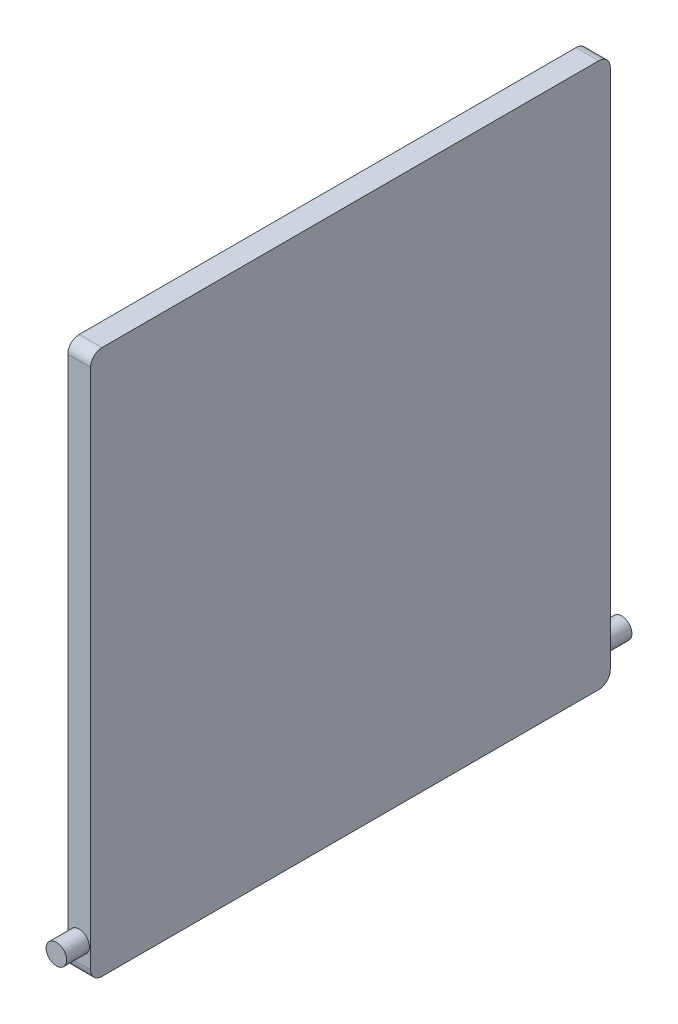
ISO-10303-21;
HEADER;
FILE_DESCRIPTION(('STEP AP214'),'2;1');
FILE_NAME('part.step','',(''),(''),'','','');
FILE_SCHEMA(('AUTOMOTIVE_DESIGN { 1 0 10303 214 1 1 1 1 }'));
ENDSEC;
DATA;
#1=APPLICATION_CONTEXT('core data for automotive mechanical design processes');
#2=APPLICATION_PROTOCOL_DEFINITION('international standard','automotive_design',2000,#1);
#3=PRODUCT_CONTEXT('',#1,'mechanical');
#4=PRODUCT('Part','Part','',(#3));
#5=PRODUCT_RELATED_PRODUCT_CATEGORY('part','',(#4));
#6=PRODUCT_DEFINITION_FORMATION('','',#4);
#7=PRODUCT_DEFINITION_CONTEXT('part definition',#1,'design');
#8=PRODUCT_DEFINITION('design','',#6,#7);
#9=PRODUCT_DEFINITION_SHAPE('','',#8);
#10=(LENGTH_UNIT() NAMED_UNIT(*) SI_UNIT(.MILLI.,.METRE.));
#11=(NAMED_UNIT(*) PLANE_ANGLE_UNIT() SI_UNIT($,.RADIAN.));
#12=(NAMED_UNIT(*) SI_UNIT($,.STERADIAN.) SOLID_ANGLE_UNIT());
#13=UNCERTAINTY_MEASURE_WITH_UNIT(LENGTH_MEASURE(1.E-05),#10,'distance_accuracy_value','');
#14=(GEOMETRIC_REPRESENTATION_CONTEXT(3) GLOBAL_UNCERTAINTY_ASSIGNED_CONTEXT((#13)) GLOBAL_UNIT_ASSIGNED_CONTEXT((#10,
#11,#12)) REPRESENTATION_CONTEXT('',''));
#15=CARTESIAN_POINT('',(0.,0.,0.));
#16=DIRECTION('',(0.,0.,1.));
#17=DIRECTION('',(1.,0.,0.));
#18=AXIS2_PLACEMENT_3D('',#15,#16,#17);
#19=CARTESIAN_POINT('',(-10.,0.,-114.));
#20=DIRECTION('',(0.,0.,-1.));
#21=DIRECTION('',(-1.,0.,0.));
#22=AXIS2_PLACEMENT_3D('',#19,#20,#21);
#23=PLANE('',#22);
#24=DIRECTION('',(0.,1.,0.));
#25=VECTOR('',#24,1.);
#26=CARTESIAN_POINT('',(0.,0.,-114.));
#27=LINE('',#26,#25);
#28=CARTESIAN_POINT('',(0.,5.,-114.));
#29=VERTEX_POINT('',#28);
#30=CARTESIAN_POINT('',(0.,233.91999995,-114.));
#31=VERTEX_POINT('',#30);
#32=EDGE_CURVE('E120',#29,#31,#27,.T.);
#33=ORIENTED_EDGE('',*,*,#32,.F.);
#34=DIRECTION('',(1.,0.,0.));
#35=VECTOR('',#34,1.);
#36=CARTESIAN_POINT('',(-10.,5.,-114.));
#37=LINE('',#36,#35);
#38=CARTESIAN_POINT('',(-10.,5.,-114.));
#39=VERTEX_POINT('',#38);
#40=EDGE_CURVE('E140',#29,#39,#37,.F.);
#41=ORIENTED_EDGE('',*,*,#40,.T.);
#42=DIRECTION('',(0.,1.,0.));
#43=VECTOR('',#42,1.);
#44=CARTESIAN_POINT('',(-10.,0.,-114.));
#45=LINE('',#44,#43);
#46=CARTESIAN_POINT('',(-10.,233.91999995,-114.));
#47=VERTEX_POINT('',#46);
#48=EDGE_CURVE('E167',#39,#47,#45,.T.);
#49=ORIENTED_EDGE('',*,*,#48,.T.);
#50=DIRECTION('',(1.,0.,0.));
#51=VECTOR('',#50,1.);
#52=CARTESIAN_POINT('',(-10.,233.91999995,-114.));
#53=LINE('',#52,#51);
#54=EDGE_CURVE('E137',#47,#31,#53,.T.);
#55=ORIENTED_EDGE('',*,*,#54,.T.);
#56=EDGE_LOOP('',(#33,#41,#49,#55));
#57=FACE_BOUND('',#56,.T.);
#58=CARTESIAN_POINT('',(-5.,13.5,-114.));
#59=DIRECTION('',(0.,0.,-1.));
#60=DIRECTION('',(-1.,0.,0.));
#61=AXIS2_PLACEMENT_3D('',#58,#59,#60);
#62=CIRCLE('',#61,4.5);
#63=CARTESIAN_POINT('',(-9.5,13.5,-114.));
#64=VERTEX_POINT('',#63);
#65=EDGE_CURVE('E171',#64,#64,#62,.T.);
#66=ORIENTED_EDGE('',*,*,#65,.F.);
#67=EDGE_LOOP('',(#66));
#68=FACE_BOUND('',#67,.T.);
#69=ADVANCED_FACE('F34',(#57,#68),#23,.T.);
#70=CARTESIAN_POINT('',(-10.,0.,114.));
#71=DIRECTION('',(0.,0.,1.));
#72=DIRECTION('',(1.,0.,0.));
#73=AXIS2_PLACEMENT_3D('',#70,#71,#72);
#74=PLANE('',#73);
#75=CARTESIAN_POINT('',(-5.,13.5,114.));
#76=DIRECTION('',(0.,0.,1.));
#77=DIRECTION('',(1.,0.,0.));
#78=AXIS2_PLACEMENT_3D('',#75,#76,#77);
#79=CIRCLE('',#78,4.5);
#80=CARTESIAN_POINT('',(-0.499999999999998,13.5,114.));
#81=VERTEX_POINT('',#80);
#82=EDGE_CURVE('E125',#81,#81,#79,.T.);
#83=ORIENTED_EDGE('',*,*,#82,.F.);
#84=EDGE_LOOP('',(#83));
#85=FACE_BOUND('',#84,.T.);
#86=DIRECTION('',(0.,-1.,0.));
#87=VECTOR('',#86,1.);
#88=CARTESIAN_POINT('',(-10.,0.,114.));
#89=LINE('',#88,#87);
#90=CARTESIAN_POINT('',(-10.,233.91999995,114.));
#91=VERTEX_POINT('',#90);
#92=CARTESIAN_POINT('',(-10.,5.,114.));
#93=VERTEX_POINT('',#92);
#94=EDGE_CURVE('E158',#91,#93,#89,.T.);
#95=ORIENTED_EDGE('',*,*,#94,.T.);
#96=DIRECTION('',(1.,0.,0.));
#97=VECTOR('',#96,1.);
#98=CARTESIAN_POINT('',(-10.,5.,114.));
#99=LINE('',#98,#97);
#100=CARTESIAN_POINT('',(0.,5.,114.));
#101=VERTEX_POINT('',#100);
#102=EDGE_CURVE('E150',#93,#101,#99,.T.);
#103=ORIENTED_EDGE('',*,*,#102,.T.);
#104=DIRECTION('',(0.,-1.,0.));
#105=VECTOR('',#104,1.);
#106=CARTESIAN_POINT('',(0.,0.,114.));
#107=LINE('',#106,#105);
#108=CARTESIAN_POINT('',(0.,233.91999995,114.));
#109=VERTEX_POINT('',#108);
#110=EDGE_CURVE('E104',#109,#101,#107,.T.);
#111=ORIENTED_EDGE('',*,*,#110,.F.);
#112=DIRECTION('',(1.,0.,0.));
#113=VECTOR('',#112,1.);
#114=CARTESIAN_POINT('',(-10.,233.91999995,114.));
#115=LINE('',#114,#113);
#116=EDGE_CURVE('E148',#109,#91,#115,.F.);
#117=ORIENTED_EDGE('',*,*,#116,.T.);
#118=EDGE_LOOP('',(#95,#103,#111,#117));
#119=FACE_BOUND('',#118,.T.);
#120=ADVANCED_FACE('F196',(#85,#119),#74,.T.);
#121=CARTESIAN_POINT('',(-10.,238.91999995,114.));
#122=DIRECTION('',(0.,1.,0.));
#123=DIRECTION('',(0.,0.,1.));
#124=AXIS2_PLACEMENT_3D('',#121,#122,#123);
#125=PLANE('',#124);
#126=DIRECTION('',(0.,0.,1.));
#127=VECTOR('',#126,1.);
#128=CARTESIAN_POINT('',(0.,238.91999995,114.));
#129=LINE('',#128,#127);
#130=CARTESIAN_POINT('',(0.,238.91999995,-109.));
#131=VERTEX_POINT('',#130);
#132=CARTESIAN_POINT('',(0.,238.91999995,109.));
#133=VERTEX_POINT('',#132);
#134=EDGE_CURVE('E155',#131,#133,#129,.T.);
#135=ORIENTED_EDGE('',*,*,#134,.F.);
#136=DIRECTION('',(1.,0.,0.));
#137=VECTOR('',#136,1.);
#138=CARTESIAN_POINT('',(-10.,238.91999995,-109.));
#139=LINE('',#138,#137);
#140=CARTESIAN_POINT('',(-10.,238.91999995,-109.));
#141=VERTEX_POINT('',#140);
#142=EDGE_CURVE('E11',#131,#141,#139,.F.);
#143=ORIENTED_EDGE('',*,*,#142,.T.);
#144=DIRECTION('',(0.,0.,1.));
#145=VECTOR('',#144,1.);
#146=CARTESIAN_POINT('',(-10.,238.91999995,114.));
#147=LINE('',#146,#145);
#148=CARTESIAN_POINT('',(-10.,238.91999995,109.));
#149=VERTEX_POINT('',#148);
#150=EDGE_CURVE('E130',#141,#149,#147,.T.);
#151=ORIENTED_EDGE('',*,*,#150,.T.);
#152=DIRECTION('',(1.,0.,0.));
#153=VECTOR('',#152,1.);
#154=CARTESIAN_POINT('',(-10.,238.91999995,109.));
#155=LINE('',#154,#153);
#156=EDGE_CURVE('E42',#149,#133,#155,.T.);
#157=ORIENTED_EDGE('',*,*,#156,.T.);
#158=EDGE_LOOP('',(#135,#143,#151,#157));
#159=FACE_BOUND('',#158,.T.);
#160=ADVANCED_FACE('F154',(#159),#125,.T.);
#161=CARTESIAN_POINT('',(-10.,0.,114.));
#162=DIRECTION('',(0.,-1.,0.));
#163=DIRECTION('',(0.,0.,-1.));
#164=AXIS2_PLACEMENT_3D('',#161,#162,#163);
#165=PLANE('',#164);
#166=DIRECTION('',(0.,0.,-1.));
#167=VECTOR('',#166,1.);
#168=CARTESIAN_POINT('',(-10.,0.,114.));
#169=LINE('',#168,#167);
#170=CARTESIAN_POINT('',(-10.,0.,109.));
#171=VERTEX_POINT('',#170);
#172=CARTESIAN_POINT('',(-10.,0.,-109.));
#173=VERTEX_POINT('',#172);
#174=EDGE_CURVE('E160',#171,#173,#169,.T.);
#175=ORIENTED_EDGE('',*,*,#174,.T.);
#176=DIRECTION('',(1.,0.,0.));
#177=VECTOR('',#176,1.);
#178=CARTESIAN_POINT('',(-10.,0.,-109.));
#179=LINE('',#178,#177);
#180=CARTESIAN_POINT('',(0.,0.,-109.));
#181=VERTEX_POINT('',#180);
#182=EDGE_CURVE('E119',#173,#181,#179,.T.);
#183=ORIENTED_EDGE('',*,*,#182,.T.);
#184=DIRECTION('',(0.,0.,-1.));
#185=VECTOR('',#184,1.);
#186=CARTESIAN_POINT('',(0.,0.,114.));
#187=LINE('',#186,#185);
#188=CARTESIAN_POINT('',(0.,0.,109.));
#189=VERTEX_POINT('',#188);
#190=EDGE_CURVE('E102',#189,#181,#187,.T.);
#191=ORIENTED_EDGE('',*,*,#190,.F.);
#192=DIRECTION('',(1.,0.,0.));
#193=VECTOR('',#192,1.);
#194=CARTESIAN_POINT('',(-10.,0.,109.));
#195=LINE('',#194,#193);
#196=EDGE_CURVE('E116',#189,#171,#195,.F.);
#197=ORIENTED_EDGE('',*,*,#196,.T.);
#198=EDGE_LOOP('',(#175,#183,#191,#197));
#199=FACE_BOUND('',#198,.T.);
#200=ADVANCED_FACE('F115',(#199),#165,.T.);
#201=CARTESIAN_POINT('',(-10.,238.91999995,114.));
#202=DIRECTION('',(-1.,0.,0.));
#203=DIRECTION('',(0.,0.,1.));
#204=AXIS2_PLACEMENT_3D('',#201,#202,#203);
#205=PLANE('',#204);
#206=ORIENTED_EDGE('',*,*,#48,.F.);
#207=CARTESIAN_POINT('',(-10.,5.,-109.));
#208=DIRECTION('',(-1.,0.,0.));
#209=DIRECTION('',(0.,0.,1.));
#210=AXIS2_PLACEMENT_3D('',#207,#208,#209);
#211=CIRCLE('',#210,5.);
#212=EDGE_CURVE('E146',#39,#173,#211,.T.);
#213=ORIENTED_EDGE('',*,*,#212,.T.);
#214=ORIENTED_EDGE('',*,*,#174,.F.);
#215=CARTESIAN_POINT('',(-10.,5.,109.));
#216=DIRECTION('',(-1.,0.,0.));
#217=DIRECTION('',(0.,0.,1.));
#218=AXIS2_PLACEMENT_3D('',#215,#216,#217);
#219=CIRCLE('',#218,5.);
#220=EDGE_CURVE('E124',#171,#93,#219,.T.);
#221=ORIENTED_EDGE('',*,*,#220,.T.);
#222=ORIENTED_EDGE('',*,*,#94,.F.);
#223=CARTESIAN_POINT('',(-10.,233.91999995,109.));
#224=DIRECTION('',(-1.,0.,0.));
#225=DIRECTION('',(0.,0.,1.));
#226=AXIS2_PLACEMENT_3D('',#223,#224,#225);
#227=CIRCLE('',#226,5.);
#228=EDGE_CURVE('E49',#91,#149,#227,.T.);
#229=ORIENTED_EDGE('',*,*,#228,.T.);
#230=ORIENTED_EDGE('',*,*,#150,.F.);
#231=CARTESIAN_POINT('',(-10.,233.91999995,-109.));
#232=DIRECTION('',(-1.,0.,0.));
#233=DIRECTION('',(0.,0.,1.));
#234=AXIS2_PLACEMENT_3D('',#231,#232,#233);
#235=CIRCLE('',#234,5.);
#236=EDGE_CURVE('E143',#141,#47,#235,.T.);
#237=ORIENTED_EDGE('',*,*,#236,.T.);
#238=EDGE_LOOP('',(#206,#213,#214,#221,#222,#229,#230,#237));
#239=FACE_BOUND('',#238,.T.);
#240=ADVANCED_FACE('F210',(#239),#205,.T.);
#241=CARTESIAN_POINT('',(0.,238.91999995,114.));
#242=DIRECTION('',(-1.,0.,0.));
#243=DIRECTION('',(0.,0.,1.));
#244=AXIS2_PLACEMENT_3D('',#241,#242,#243);
#245=PLANE('',#244);
#246=ORIENTED_EDGE('',*,*,#190,.T.);
#247=CARTESIAN_POINT('',(0.,5.,-109.));
#248=DIRECTION('',(-1.,0.,0.));
#249=DIRECTION('',(0.,0.,1.));
#250=AXIS2_PLACEMENT_3D('',#247,#248,#249);
#251=CIRCLE('',#250,5.);
#252=EDGE_CURVE('E109',#181,#29,#251,.F.);
#253=ORIENTED_EDGE('',*,*,#252,.T.);
#254=ORIENTED_EDGE('',*,*,#32,.T.);
#255=CARTESIAN_POINT('',(0.,233.91999995,-109.));
#256=DIRECTION('',(-1.,0.,0.));
#257=DIRECTION('',(0.,0.,1.));
#258=AXIS2_PLACEMENT_3D('',#255,#256,#257);
#259=CIRCLE('',#258,5.);
#260=EDGE_CURVE('E110',#31,#131,#259,.F.);
#261=ORIENTED_EDGE('',*,*,#260,.T.);
#262=ORIENTED_EDGE('',*,*,#134,.T.);
#263=CARTESIAN_POINT('',(0.,233.91999995,109.));
#264=DIRECTION('',(-1.,0.,0.));
#265=DIRECTION('',(0.,0.,1.));
#266=AXIS2_PLACEMENT_3D('',#263,#264,#265);
#267=CIRCLE('',#266,5.);
#268=EDGE_CURVE('E127',#133,#109,#267,.F.);
#269=ORIENTED_EDGE('',*,*,#268,.T.);
#270=ORIENTED_EDGE('',*,*,#110,.T.);
#271=CARTESIAN_POINT('',(0.,5.,109.));
#272=DIRECTION('',(-1.,0.,0.));
#273=DIRECTION('',(0.,0.,1.));
#274=AXIS2_PLACEMENT_3D('',#271,#272,#273);
#275=CIRCLE('',#274,5.);
#276=EDGE_CURVE('E99',#101,#189,#275,.F.);
#277=ORIENTED_EDGE('',*,*,#276,.T.);
#278=EDGE_LOOP('',(#246,#253,#254,#261,#262,#269,#270,#277));
#279=FACE_BOUND('',#278,.T.);
#280=ADVANCED_FACE('F101',(#279),#245,.F.);
#281=CARTESIAN_POINT('',(-5.,13.5,-124.));
#282=DIRECTION('',(0.,0.,1.));
#283=DIRECTION('',(1.,0.,0.));
#284=AXIS2_PLACEMENT_3D('',#281,#282,#283);
#285=CYLINDRICAL_SURFACE('',#284,4.5);
#286=CARTESIAN_POINT('',(-5.,13.5,-124.));
#287=DIRECTION('',(0.,0.,-1.));
#288=DIRECTION('',(-1.,0.,0.));
#289=AXIS2_PLACEMENT_3D('',#286,#287,#288);
#290=CIRCLE('',#289,4.5);
#291=CARTESIAN_POINT('',(-9.5,13.5,-124.));
#292=VERTEX_POINT('',#291);
#293=EDGE_CURVE('E165',#292,#292,#290,.T.);
#294=ORIENTED_EDGE('',*,*,#293,.F.);
#295=EDGE_LOOP('',(#294));
#296=FACE_BOUND('',#295,.T.);
#297=ORIENTED_EDGE('',*,*,#65,.T.);
#298=EDGE_LOOP('',(#297));
#299=FACE_BOUND('',#298,.T.);
#300=ADVANCED_FACE('F231',(#296,#299),#285,.T.);
#301=CARTESIAN_POINT('',(-5.,13.5,-124.));
#302=DIRECTION('',(0.,0.,-1.));
#303=DIRECTION('',(-1.,0.,0.));
#304=AXIS2_PLACEMENT_3D('',#301,#302,#303);
#305=PLANE('',#304);
#306=ORIENTED_EDGE('',*,*,#293,.T.);
#307=EDGE_LOOP('',(#306));
#308=FACE_BOUND('',#307,.T.);
#309=ADVANCED_FACE('F193',(#308),#305,.T.);
#310=CARTESIAN_POINT('',(-5.,13.5,124.));
#311=DIRECTION('',(0.,0.,-1.));
#312=DIRECTION('',(-1.,0.,0.));
#313=AXIS2_PLACEMENT_3D('',#310,#311,#312);
#314=CYLINDRICAL_SURFACE('',#313,4.5);
#315=CARTESIAN_POINT('',(-5.,13.5,124.));
#316=DIRECTION('',(0.,0.,-1.));
#317=DIRECTION('',(-1.,0.,0.));
#318=AXIS2_PLACEMENT_3D('',#315,#316,#317);
#319=CIRCLE('',#318,4.5);
#320=CARTESIAN_POINT('',(-9.5,13.5,124.));
#321=VERTEX_POINT('',#320);
#322=EDGE_CURVE('E174',#321,#321,#319,.T.);
#323=ORIENTED_EDGE('',*,*,#322,.T.);
#324=EDGE_LOOP('',(#323));
#325=FACE_BOUND('',#324,.T.);
#326=ORIENTED_EDGE('',*,*,#82,.T.);
#327=EDGE_LOOP('',(#326));
#328=FACE_BOUND('',#327,.T.);
#329=ADVANCED_FACE('F180',(#325,#328),#314,.T.);
#330=CARTESIAN_POINT('',(-5.,13.5,124.));
#331=DIRECTION('',(0.,0.,1.));
#332=DIRECTION('',(-1.,0.,0.));
#333=AXIS2_PLACEMENT_3D('',#330,#331,#332);
#334=PLANE('',#333);
#335=ORIENTED_EDGE('',*,*,#322,.F.);
#336=EDGE_LOOP('',(#335));
#337=FACE_BOUND('',#336,.T.);
#338=ADVANCED_FACE('F183',(#337),#334,.T.);
#339=CARTESIAN_POINT('',(-10.,5.,-109.));
#340=DIRECTION('',(1.,0.,0.));
#341=DIRECTION('',(0.,0.,-1.));
#342=AXIS2_PLACEMENT_3D('',#339,#340,#341);
#343=CYLINDRICAL_SURFACE('',#342,5.);
#344=ORIENTED_EDGE('',*,*,#212,.F.);
#345=ORIENTED_EDGE('',*,*,#40,.F.);
#346=ORIENTED_EDGE('',*,*,#252,.F.);
#347=ORIENTED_EDGE('',*,*,#182,.F.);
#348=EDGE_LOOP('',(#344,#345,#346,#347));
#349=FACE_BOUND('',#348,.T.);
#350=ADVANCED_FACE('F185',(#349),#343,.T.);
#351=CARTESIAN_POINT('',(-10.,5.,109.));
#352=DIRECTION('',(1.,0.,0.));
#353=DIRECTION('',(0.,0.,-1.));
#354=AXIS2_PLACEMENT_3D('',#351,#352,#353);
#355=CYLINDRICAL_SURFACE('',#354,5.);
#356=ORIENTED_EDGE('',*,*,#220,.F.);
#357=ORIENTED_EDGE('',*,*,#196,.F.);
#358=ORIENTED_EDGE('',*,*,#276,.F.);
#359=ORIENTED_EDGE('',*,*,#102,.F.);
#360=EDGE_LOOP('',(#356,#357,#358,#359));
#361=FACE_BOUND('',#360,.T.);
#362=ADVANCED_FACE('F123',(#361),#355,.T.);
#363=CARTESIAN_POINT('',(-10.,233.91999995,-109.));
#364=DIRECTION('',(1.,0.,0.));
#365=DIRECTION('',(0.,0.,-1.));
#366=AXIS2_PLACEMENT_3D('',#363,#364,#365);
#367=CYLINDRICAL_SURFACE('',#366,5.);
#368=ORIENTED_EDGE('',*,*,#236,.F.);
#369=ORIENTED_EDGE('',*,*,#142,.F.);
#370=ORIENTED_EDGE('',*,*,#260,.F.);
#371=ORIENTED_EDGE('',*,*,#54,.F.);
#372=EDGE_LOOP('',(#368,#369,#370,#371));
#373=FACE_BOUND('',#372,.T.);
#374=ADVANCED_FACE('F213',(#373),#367,.T.);
#375=CARTESIAN_POINT('',(-10.,233.91999995,109.));
#376=DIRECTION('',(1.,0.,0.));
#377=DIRECTION('',(0.,0.,-1.));
#378=AXIS2_PLACEMENT_3D('',#375,#376,#377);
#379=CYLINDRICAL_SURFACE('',#378,5.);
#380=ORIENTED_EDGE('',*,*,#228,.F.);
#381=ORIENTED_EDGE('',*,*,#116,.F.);
#382=ORIENTED_EDGE('',*,*,#268,.F.);
#383=ORIENTED_EDGE('',*,*,#156,.F.);
#384=EDGE_LOOP('',(#380,#381,#382,#383));
#385=FACE_BOUND('',#384,.T.);
#386=ADVANCED_FACE('F36',(#385),#379,.T.);
#387=CLOSED_SHELL('',(#69,#120,#160,#200,#240,#280,#300,#309,#329,#338,#350,#362,#374,#386));
#388=MANIFOLD_SOLID_BREP('B2',#387);
#389=ADVANCED_BREP_SHAPE_REPRESENTATION('',(#18,#388),#14);
#390=SHAPE_DEFINITION_REPRESENTATION(#9,#389);
ENDSEC;
END-ISO-10303-21;
